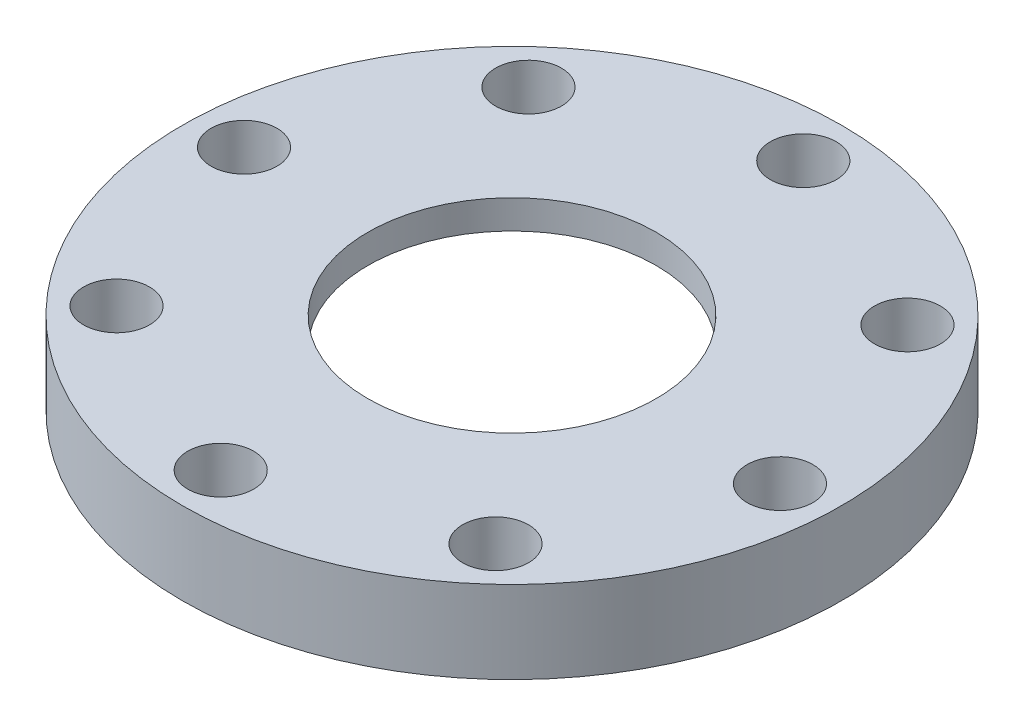
ISO-10303-21;
HEADER;
FILE_DESCRIPTION(('STEP AP214'),'2;1');
FILE_NAME('part.step','',(''),(''),'','','');
FILE_SCHEMA(('AUTOMOTIVE_DESIGN { 1 0 10303 214 1 1 1 1 }'));
ENDSEC;
DATA;
#1=APPLICATION_CONTEXT('core data for automotive mechanical design processes');
#2=APPLICATION_PROTOCOL_DEFINITION('international standard','automotive_design',2000,#1);
#3=PRODUCT_CONTEXT('',#1,'mechanical');
#4=PRODUCT('Part','Part','',(#3));
#5=PRODUCT_RELATED_PRODUCT_CATEGORY('part','',(#4));
#6=PRODUCT_DEFINITION_FORMATION('','',#4);
#7=PRODUCT_DEFINITION_CONTEXT('part definition',#1,'design');
#8=PRODUCT_DEFINITION('design','',#6,#7);
#9=PRODUCT_DEFINITION_SHAPE('','',#8);
#10=(LENGTH_UNIT() NAMED_UNIT(*) SI_UNIT(.MILLI.,.METRE.));
#11=(NAMED_UNIT(*) PLANE_ANGLE_UNIT() SI_UNIT($,.RADIAN.));
#12=(NAMED_UNIT(*) SI_UNIT($,.STERADIAN.) SOLID_ANGLE_UNIT());
#13=UNCERTAINTY_MEASURE_WITH_UNIT(LENGTH_MEASURE(1.E-05),#10,'distance_accuracy_value','');
#14=(GEOMETRIC_REPRESENTATION_CONTEXT(3) GLOBAL_UNCERTAINTY_ASSIGNED_CONTEXT((#13)) GLOBAL_UNIT_ASSIGNED_CONTEXT((#10,
#11,#12)) REPRESENTATION_CONTEXT('',''));
#15=CARTESIAN_POINT('',(0.,0.,0.));
#16=DIRECTION('',(0.,0.,1.));
#17=DIRECTION('',(1.,0.,0.));
#18=AXIS2_PLACEMENT_3D('',#15,#16,#17);
#19=CARTESIAN_POINT('',(0.,10.,0.));
#20=DIRECTION('',(0.,-1.,0.));
#21=DIRECTION('',(0.,0.,-1.));
#22=AXIS2_PLACEMENT_3D('',#19,#20,#21);
#23=CYLINDRICAL_SURFACE('',#22,40.);
#24=CARTESIAN_POINT('',(0.,10.,0.));
#25=DIRECTION('',(0.,1.,0.));
#26=DIRECTION('',(0.,0.,1.));
#27=AXIS2_PLACEMENT_3D('',#24,#25,#26);
#28=CIRCLE('',#27,40.);
#29=CARTESIAN_POINT('',(0.,10.,40.));
#30=VERTEX_POINT('',#29);
#31=EDGE_CURVE('E10',#30,#30,#28,.T.);
#32=ORIENTED_EDGE('',*,*,#31,.F.);
#33=EDGE_LOOP('',(#32));
#34=FACE_BOUND('',#33,.T.);
#35=CARTESIAN_POINT('',(0.,0.,0.));
#36=DIRECTION('',(0.,1.,0.));
#37=DIRECTION('',(0.,0.,1.));
#38=AXIS2_PLACEMENT_3D('',#35,#36,#37);
#39=CIRCLE('',#38,40.);
#40=CARTESIAN_POINT('',(0.,0.,40.));
#41=VERTEX_POINT('',#40);
#42=EDGE_CURVE('E47',#41,#41,#39,.T.);
#43=ORIENTED_EDGE('',*,*,#42,.T.);
#44=EDGE_LOOP('',(#43));
#45=FACE_BOUND('',#44,.T.);
#46=ADVANCED_FACE('F39',(#34,#45),#23,.T.);
#47=CARTESIAN_POINT('',(0.,10.,0.));
#48=DIRECTION('',(0.,1.,0.));
#49=DIRECTION('',(0.,0.,1.));
#50=AXIS2_PLACEMENT_3D('',#47,#48,#49);
#51=PLANE('',#50);
#52=CARTESIAN_POINT('',(-1.41421356237434,10.,33.941125496957));
#53=DIRECTION('',(0.,-1.,0.));
#54=DIRECTION('',(0.,0.,-1.));
#55=AXIS2_PLACEMENT_3D('',#52,#53,#54);
#56=CIRCLE('',#55,4.00000000000239);
#57=CARTESIAN_POINT('',(-1.41421356237434,10.,29.9411254969546));
#58=VERTEX_POINT('',#57);
#59=EDGE_CURVE('E66',#58,#58,#56,.T.);
#60=ORIENTED_EDGE('',*,*,#59,.T.);
#61=EDGE_LOOP('',(#60));
#62=FACE_BOUND('',#61,.T.);
#63=CARTESIAN_POINT('',(22.9999999999998,10.,25.0000000000054));
#64=DIRECTION('',(0.,-1.,0.));
#65=DIRECTION('',(0.,0.,-1.));
#66=AXIS2_PLACEMENT_3D('',#63,#64,#65);
#67=CIRCLE('',#66,4.00000000000536);
#68=CARTESIAN_POINT('',(22.9999999999998,10.,21.0000000000001));
#69=VERTEX_POINT('',#68);
#70=EDGE_CURVE('E115',#69,#69,#67,.T.);
#71=ORIENTED_EDGE('',*,*,#70,.T.);
#72=EDGE_LOOP('',(#71));
#73=FACE_BOUND('',#72,.T.);
#74=CARTESIAN_POINT('',(33.9411254969567,10.,1.41421356237977));
#75=DIRECTION('',(0.,-1.,0.));
#76=DIRECTION('',(0.,0.,-1.));
#77=AXIS2_PLACEMENT_3D('',#74,#75,#76);
#78=CIRCLE('',#77,4.00000000000719);
#79=CARTESIAN_POINT('',(33.9411254969567,10.,-2.58578643762742));
#80=VERTEX_POINT('',#79);
#81=EDGE_CURVE('E107',#80,#80,#78,.T.);
#82=ORIENTED_EDGE('',*,*,#81,.T.);
#83=EDGE_LOOP('',(#82));
#84=FACE_BOUND('',#83,.T.);
#85=CARTESIAN_POINT('',(25.0000000000052,10.,-22.9999999999943));
#86=DIRECTION('',(0.,-1.,0.));
#87=DIRECTION('',(0.,0.,-1.));
#88=AXIS2_PLACEMENT_3D('',#85,#86,#87);
#89=CIRCLE('',#88,4.00000000000685);
#90=CARTESIAN_POINT('',(25.0000000000052,10.,-27.0000000000012));
#91=VERTEX_POINT('',#90);
#92=EDGE_CURVE('E99',#91,#91,#89,.T.);
#93=ORIENTED_EDGE('',*,*,#92,.T.);
#94=EDGE_LOOP('',(#93));
#95=FACE_BOUND('',#94,.T.);
#96=CARTESIAN_POINT('',(1.41421356237955,10.,-33.9411254969513));
#97=DIRECTION('',(0.,-1.,0.));
#98=DIRECTION('',(0.,0.,-1.));
#99=AXIS2_PLACEMENT_3D('',#96,#97,#98);
#100=CIRCLE('',#99,4.00000000000455);
#101=CARTESIAN_POINT('',(1.41421356237955,10.,-37.9411254969558));
#102=VERTEX_POINT('',#101);
#103=EDGE_CURVE('E91',#102,#102,#100,.T.);
#104=ORIENTED_EDGE('',*,*,#103,.T.);
#105=EDGE_LOOP('',(#104));
#106=FACE_BOUND('',#105,.T.);
#107=CARTESIAN_POINT('',(-22.9999999999946,10.,-24.9999999999998));
#108=DIRECTION('',(0.,-1.,0.));
#109=DIRECTION('',(0.,0.,-1.));
#110=AXIS2_PLACEMENT_3D('',#107,#108,#109);
#111=CIRCLE('',#110,4.00000000000168);
#112=CARTESIAN_POINT('',(-22.9999999999946,10.,-29.0000000000015));
#113=VERTEX_POINT('',#112);
#114=EDGE_CURVE('E83',#113,#113,#111,.T.);
#115=ORIENTED_EDGE('',*,*,#114,.T.);
#116=EDGE_LOOP('',(#115));
#117=FACE_BOUND('',#116,.T.);
#118=CARTESIAN_POINT('',(-33.9411254969515,10.,-1.41421356237412));
#119=DIRECTION('',(0.,-1.,0.));
#120=DIRECTION('',(0.,0.,-1.));
#121=AXIS2_PLACEMENT_3D('',#118,#119,#120);
#122=CIRCLE('',#121,3.99999999999996);
#123=CARTESIAN_POINT('',(-33.9411254969515,10.,-5.41421356237408));
#124=VERTEX_POINT('',#123);
#125=EDGE_CURVE('E75',#124,#124,#122,.T.);
#126=ORIENTED_EDGE('',*,*,#125,.T.);
#127=EDGE_LOOP('',(#126));
#128=FACE_BOUND('',#127,.T.);
#129=CARTESIAN_POINT('',(-25.,10.,23.));
#130=DIRECTION('',(0.,-1.,0.));
#131=DIRECTION('',(0.,0.,-1.));
#132=AXIS2_PLACEMENT_3D('',#129,#130,#131);
#133=CIRCLE('',#132,4.);
#134=CARTESIAN_POINT('',(-25.,10.,19.));
#135=VERTEX_POINT('',#134);
#136=EDGE_CURVE('E67',#135,#135,#133,.T.);
#137=ORIENTED_EDGE('',*,*,#136,.T.);
#138=EDGE_LOOP('',(#137));
#139=FACE_BOUND('',#138,.T.);
#140=CARTESIAN_POINT('',(0.,10.,0.));
#141=DIRECTION('',(0.,1.,0.));
#142=DIRECTION('',(0.,0.,1.));
#143=AXIS2_PLACEMENT_3D('',#140,#141,#142);
#144=CIRCLE('',#143,17.5);
#145=CARTESIAN_POINT('',(0.,10.,17.5));
#146=VERTEX_POINT('',#145);
#147=EDGE_CURVE('E62',#146,#146,#144,.T.);
#148=ORIENTED_EDGE('',*,*,#147,.F.);
#149=EDGE_LOOP('',(#148));
#150=FACE_BOUND('',#149,.T.);
#151=ORIENTED_EDGE('',*,*,#31,.T.);
#152=EDGE_LOOP('',(#151));
#153=FACE_BOUND('',#152,.T.);
#154=ADVANCED_FACE('F131',(#62,#73,#84,#95,#106,#117,#128,#139,#150,#153),#51,.T.);
#155=CARTESIAN_POINT('',(0.,0.,0.));
#156=DIRECTION('',(0.,1.,0.));
#157=DIRECTION('',(0.,0.,1.));
#158=AXIS2_PLACEMENT_3D('',#155,#156,#157);
#159=PLANE('',#158);
#160=CARTESIAN_POINT('',(-1.41421356237434,0.,33.941125496957));
#161=DIRECTION('',(0.,-1.,0.));
#162=DIRECTION('',(0.,0.,-1.));
#163=AXIS2_PLACEMENT_3D('',#160,#161,#162);
#164=CIRCLE('',#163,4.00000000000239);
#165=CARTESIAN_POINT('',(-1.41421356237434,0.,29.9411254969546));
#166=VERTEX_POINT('',#165);
#167=EDGE_CURVE('E123',#166,#166,#164,.T.);
#168=ORIENTED_EDGE('',*,*,#167,.F.);
#169=EDGE_LOOP('',(#168));
#170=FACE_BOUND('',#169,.T.);
#171=CARTESIAN_POINT('',(22.9999999999998,0.,25.0000000000054));
#172=DIRECTION('',(0.,-1.,0.));
#173=DIRECTION('',(0.,0.,-1.));
#174=AXIS2_PLACEMENT_3D('',#171,#172,#173);
#175=CIRCLE('',#174,4.00000000000536);
#176=CARTESIAN_POINT('',(22.9999999999998,0.,21.0000000000001));
#177=VERTEX_POINT('',#176);
#178=EDGE_CURVE('E119',#177,#177,#175,.T.);
#179=ORIENTED_EDGE('',*,*,#178,.F.);
#180=EDGE_LOOP('',(#179));
#181=FACE_BOUND('',#180,.T.);
#182=CARTESIAN_POINT('',(33.9411254969567,0.,1.41421356237977));
#183=DIRECTION('',(0.,-1.,0.));
#184=DIRECTION('',(0.,0.,-1.));
#185=AXIS2_PLACEMENT_3D('',#182,#183,#184);
#186=CIRCLE('',#185,4.00000000000719);
#187=CARTESIAN_POINT('',(33.9411254969567,0.,-2.58578643762742));
#188=VERTEX_POINT('',#187);
#189=EDGE_CURVE('E111',#188,#188,#186,.T.);
#190=ORIENTED_EDGE('',*,*,#189,.F.);
#191=EDGE_LOOP('',(#190));
#192=FACE_BOUND('',#191,.T.);
#193=CARTESIAN_POINT('',(25.0000000000052,0.,-22.9999999999943));
#194=DIRECTION('',(0.,-1.,0.));
#195=DIRECTION('',(0.,0.,-1.));
#196=AXIS2_PLACEMENT_3D('',#193,#194,#195);
#197=CIRCLE('',#196,4.00000000000685);
#198=CARTESIAN_POINT('',(25.0000000000052,0.,-27.0000000000012));
#199=VERTEX_POINT('',#198);
#200=EDGE_CURVE('E103',#199,#199,#197,.T.);
#201=ORIENTED_EDGE('',*,*,#200,.F.);
#202=EDGE_LOOP('',(#201));
#203=FACE_BOUND('',#202,.T.);
#204=CARTESIAN_POINT('',(1.41421356237955,0.,-33.9411254969513));
#205=DIRECTION('',(0.,-1.,0.));
#206=DIRECTION('',(0.,0.,-1.));
#207=AXIS2_PLACEMENT_3D('',#204,#205,#206);
#208=CIRCLE('',#207,4.00000000000455);
#209=CARTESIAN_POINT('',(1.41421356237955,0.,-37.9411254969558));
#210=VERTEX_POINT('',#209);
#211=EDGE_CURVE('E95',#210,#210,#208,.T.);
#212=ORIENTED_EDGE('',*,*,#211,.F.);
#213=EDGE_LOOP('',(#212));
#214=FACE_BOUND('',#213,.T.);
#215=CARTESIAN_POINT('',(-22.9999999999946,0.,-24.9999999999998));
#216=DIRECTION('',(0.,-1.,0.));
#217=DIRECTION('',(0.,0.,-1.));
#218=AXIS2_PLACEMENT_3D('',#215,#216,#217);
#219=CIRCLE('',#218,4.00000000000168);
#220=CARTESIAN_POINT('',(-22.9999999999946,0.,-29.0000000000015));
#221=VERTEX_POINT('',#220);
#222=EDGE_CURVE('E87',#221,#221,#219,.T.);
#223=ORIENTED_EDGE('',*,*,#222,.F.);
#224=EDGE_LOOP('',(#223));
#225=FACE_BOUND('',#224,.T.);
#226=CARTESIAN_POINT('',(-33.9411254969515,0.,-1.41421356237412));
#227=DIRECTION('',(0.,-1.,0.));
#228=DIRECTION('',(0.,0.,-1.));
#229=AXIS2_PLACEMENT_3D('',#226,#227,#228);
#230=CIRCLE('',#229,3.99999999999996);
#231=CARTESIAN_POINT('',(-33.9411254969515,0.,-5.41421356237408));
#232=VERTEX_POINT('',#231);
#233=EDGE_CURVE('E79',#232,#232,#230,.T.);
#234=ORIENTED_EDGE('',*,*,#233,.F.);
#235=EDGE_LOOP('',(#234));
#236=FACE_BOUND('',#235,.T.);
#237=CARTESIAN_POINT('',(-25.,0.,23.));
#238=DIRECTION('',(0.,-1.,0.));
#239=DIRECTION('',(0.,0.,-1.));
#240=AXIS2_PLACEMENT_3D('',#237,#238,#239);
#241=CIRCLE('',#240,4.);
#242=CARTESIAN_POINT('',(-25.,0.,19.));
#243=VERTEX_POINT('',#242);
#244=EDGE_CURVE('E71',#243,#243,#241,.T.);
#245=ORIENTED_EDGE('',*,*,#244,.F.);
#246=EDGE_LOOP('',(#245));
#247=FACE_BOUND('',#246,.T.);
#248=CARTESIAN_POINT('',(0.,0.,0.));
#249=DIRECTION('',(0.,-1.,0.));
#250=DIRECTION('',(0.,0.,-1.));
#251=AXIS2_PLACEMENT_3D('',#248,#249,#250);
#252=CIRCLE('',#251,27.5);
#253=CARTESIAN_POINT('',(0.,0.,-27.5));
#254=VERTEX_POINT('',#253);
#255=EDGE_CURVE('E55',#254,#254,#252,.T.);
#256=ORIENTED_EDGE('',*,*,#255,.F.);
#257=EDGE_LOOP('',(#256));
#258=FACE_BOUND('',#257,.T.);
#259=ORIENTED_EDGE('',*,*,#42,.F.);
#260=EDGE_LOOP('',(#259));
#261=FACE_BOUND('',#260,.T.);
#262=ADVANCED_FACE('F141',(#170,#181,#192,#203,#214,#225,#236,#247,#258,#261),#159,.F.);
#263=CARTESIAN_POINT('',(0.,6.5,0.));
#264=DIRECTION('',(0.,-1.,0.));
#265=DIRECTION('',(0.,0.,-1.));
#266=AXIS2_PLACEMENT_3D('',#263,#264,#265);
#267=CYLINDRICAL_SURFACE('',#266,27.5);
#268=CARTESIAN_POINT('',(0.,6.5,0.));
#269=DIRECTION('',(0.,-1.,0.));
#270=DIRECTION('',(0.,0.,-1.));
#271=AXIS2_PLACEMENT_3D('',#268,#269,#270);
#272=CIRCLE('',#271,27.5);
#273=CARTESIAN_POINT('',(0.,6.5,-27.5));
#274=VERTEX_POINT('',#273);
#275=EDGE_CURVE('E53',#274,#274,#272,.T.);
#276=CARTESIAN_POINT('',(0.,6.5,-27.5));
#277=CARTESIAN_POINT('',(0.,6.43229166666667,-27.5));
#278=CARTESIAN_POINT('',(0.,6.36458333333333,-27.5));
#279=CARTESIAN_POINT('',(0.,6.22916666666667,-27.5));
#280=CARTESIAN_POINT('',(0.,6.16145833333333,-27.5));
#281=CARTESIAN_POINT('',(0.,6.02604166666667,-27.5));
#282=CARTESIAN_POINT('',(0.,5.95833333333333,-27.5));
#283=CARTESIAN_POINT('',(0.,5.82291666666667,-27.5));
#284=CARTESIAN_POINT('',(0.,5.75520833333333,-27.5));
#285=CARTESIAN_POINT('',(0.,5.61979166666667,-27.5));
#286=CARTESIAN_POINT('',(0.,5.55208333333333,-27.5));
#287=CARTESIAN_POINT('',(0.,5.41666666666667,-27.5));
#288=CARTESIAN_POINT('',(0.,5.34895833333333,-27.5));
#289=CARTESIAN_POINT('',(0.,5.21354166666667,-27.5));
#290=CARTESIAN_POINT('',(0.,5.14583333333333,-27.5));
#291=CARTESIAN_POINT('',(0.,5.01041666666667,-27.5));
#292=CARTESIAN_POINT('',(0.,4.94270833333333,-27.5));
#293=CARTESIAN_POINT('',(0.,4.80729166666667,-27.5));
#294=CARTESIAN_POINT('',(0.,4.73958333333333,-27.5));
#295=CARTESIAN_POINT('',(0.,4.60416666666667,-27.5));
#296=CARTESIAN_POINT('',(0.,4.53645833333333,-27.5));
#297=CARTESIAN_POINT('',(0.,4.40104166666667,-27.5));
#298=CARTESIAN_POINT('',(0.,4.33333333333333,-27.5));
#299=CARTESIAN_POINT('',(0.,4.19791666666667,-27.5));
#300=CARTESIAN_POINT('',(0.,4.13020833333333,-27.5));
#301=CARTESIAN_POINT('',(0.,3.99479166666667,-27.5));
#302=CARTESIAN_POINT('',(0.,3.92708333333333,-27.5));
#303=CARTESIAN_POINT('',(0.,3.79166666666667,-27.5));
#304=CARTESIAN_POINT('',(0.,3.72395833333333,-27.5));
#305=CARTESIAN_POINT('',(0.,3.58854166666667,-27.5));
#306=CARTESIAN_POINT('',(0.,3.52083333333333,-27.5));
#307=CARTESIAN_POINT('',(0.,3.38541666666667,-27.5));
#308=CARTESIAN_POINT('',(0.,3.31770833333333,-27.5));
#309=CARTESIAN_POINT('',(0.,3.18229166666667,-27.5));
#310=CARTESIAN_POINT('',(0.,3.11458333333333,-27.5));
#311=CARTESIAN_POINT('',(0.,2.97916666666667,-27.5));
#312=CARTESIAN_POINT('',(0.,2.91145833333333,-27.5));
#313=CARTESIAN_POINT('',(0.,2.77604166666667,-27.5));
#314=CARTESIAN_POINT('',(0.,2.70833333333333,-27.5));
#315=CARTESIAN_POINT('',(0.,2.57291666666667,-27.5));
#316=CARTESIAN_POINT('',(0.,2.50520833333333,-27.5));
#317=CARTESIAN_POINT('',(0.,2.36979166666667,-27.5));
#318=CARTESIAN_POINT('',(0.,2.30208333333333,-27.5));
#319=CARTESIAN_POINT('',(0.,2.16666666666667,-27.5));
#320=CARTESIAN_POINT('',(0.,2.09895833333333,-27.5));
#321=CARTESIAN_POINT('',(0.,1.96354166666667,-27.5));
#322=CARTESIAN_POINT('',(0.,1.89583333333333,-27.5));
#323=CARTESIAN_POINT('',(0.,1.76041666666667,-27.5));
#324=CARTESIAN_POINT('',(0.,1.69270833333333,-27.5));
#325=CARTESIAN_POINT('',(0.,1.55729166666667,-27.5));
#326=CARTESIAN_POINT('',(0.,1.48958333333333,-27.5));
#327=CARTESIAN_POINT('',(0.,1.35416666666667,-27.5));
#328=CARTESIAN_POINT('',(0.,1.28645833333333,-27.5));
#329=CARTESIAN_POINT('',(0.,1.15104166666667,-27.5));
#330=CARTESIAN_POINT('',(0.,1.08333333333333,-27.5));
#331=CARTESIAN_POINT('',(0.,0.947916666666667,-27.5));
#332=CARTESIAN_POINT('',(0.,0.880208333333333,-27.5));
#333=CARTESIAN_POINT('',(0.,0.744791666666667,-27.5));
#334=CARTESIAN_POINT('',(0.,0.677083333333334,-27.5));
#335=CARTESIAN_POINT('',(0.,0.541666666666667,-27.5));
#336=CARTESIAN_POINT('',(0.,0.473958333333334,-27.5));
#337=CARTESIAN_POINT('',(0.,0.338541666666667,-27.5));
#338=CARTESIAN_POINT('',(0.,0.270833333333334,-27.5));
#339=CARTESIAN_POINT('',(0.,0.135416666666667,-27.5));
#340=CARTESIAN_POINT('',(0.,0.0677083333333333,-27.5));
#341=CARTESIAN_POINT('',(0.,0.,-27.5));
#342=B_SPLINE_CURVE_WITH_KNOTS('',3,(#276,#277,#278,#279,#280,#281,#282,#283,#284,#285,#286,
#287,#288,#289,#290,#291,#292,#293,#294,#295,#296,#297,#298,#299,#300,#301,#302,#303,#304,#305,
#306,#307,#308,#309,#310,#311,#312,#313,#314,#315,#316,#317,#318,#319,#320,#321,#322,#323,#324,
#325,#326,#327,#328,#329,#330,#331,#332,#333,#334,#335,#336,#337,#338,#339,#340,#341),
.UNSPECIFIED.,.F.,.F.,(4,2,2,2,2,2,2,2,2,2,2,2,2,2,2,2,2,2,2,2,2,2,2,2,2,2,2,2,2,2,2,2,4),(0.,
0.203125,0.40625,0.609375000000001,0.812500000000001,1.015625,1.21875,1.421875,1.625,1.828125,
2.03125,2.234375,2.4375,2.640625,2.84375,3.046875,3.25,3.453125,3.65625,3.859375,4.0625,
4.265625,4.46875,4.671875,4.875,5.078125,5.28125,5.484375,5.6875,5.890625,6.09375,6.296875,6.5),.UNSPECIFIED.);
#343=EDGE_CURVE('BSEAM144',#274,#254,#342,.T.);
#344=ORIENTED_EDGE('',*,*,#275,.F.);
#345=ORIENTED_EDGE('',*,*,#255,.T.);
#346=ORIENTED_EDGE('',*,*,#343,.T.);
#347=ORIENTED_EDGE('',*,*,#343,.F.);
#348=EDGE_LOOP('',(#344,#346,#345,#347));
#349=FACE_BOUND('',#348,.T.);
#350=ADVANCED_FACE('F144',(#349),#267,.F.);
#351=CARTESIAN_POINT('',(0.,6.5,0.));
#352=DIRECTION('',(0.,-1.,0.));
#353=DIRECTION('',(0.,0.,-1.));
#354=AXIS2_PLACEMENT_3D('',#351,#352,#353);
#355=PLANE('',#354);
#356=CARTESIAN_POINT('',(0.,6.5,0.));
#357=DIRECTION('',(0.,-1.,0.));
#358=DIRECTION('',(0.,0.,-1.));
#359=AXIS2_PLACEMENT_3D('',#356,#357,#358);
#360=CIRCLE('',#359,17.5);
#361=CARTESIAN_POINT('',(0.,6.5,-17.5));
#362=VERTEX_POINT('',#361);
#363=EDGE_CURVE('E42',#362,#362,#360,.T.);
#364=ORIENTED_EDGE('',*,*,#363,.F.);
#365=EDGE_LOOP('',(#364));
#366=FACE_BOUND('',#365,.T.);
#367=ORIENTED_EDGE('',*,*,#275,.T.);
#368=EDGE_LOOP('',(#367));
#369=FACE_BOUND('',#368,.T.);
#370=ADVANCED_FACE('F174',(#366,#369),#355,.T.);
#371=CARTESIAN_POINT('',(0.,0.,0.));
#372=DIRECTION('',(0.,1.,0.));
#373=DIRECTION('',(0.,0.,1.));
#374=AXIS2_PLACEMENT_3D('',#371,#372,#373);
#375=CYLINDRICAL_SURFACE('',#374,17.5);
#376=ORIENTED_EDGE('',*,*,#363,.T.);
#377=EDGE_LOOP('',(#376));
#378=FACE_BOUND('',#377,.T.);
#379=ORIENTED_EDGE('',*,*,#147,.T.);
#380=EDGE_LOOP('',(#379));
#381=FACE_BOUND('',#380,.T.);
#382=ADVANCED_FACE('F178',(#378,#381),#375,.F.);
#383=CARTESIAN_POINT('',(-25.,10.,23.));
#384=DIRECTION('',(0.,-1.,0.));
#385=DIRECTION('',(0.,0.,-1.));
#386=AXIS2_PLACEMENT_3D('',#383,#384,#385);
#387=CYLINDRICAL_SURFACE('',#386,4.);
#388=ORIENTED_EDGE('',*,*,#136,.F.);
#389=EDGE_LOOP('',(#388));
#390=FACE_BOUND('',#389,.T.);
#391=ORIENTED_EDGE('',*,*,#244,.T.);
#392=EDGE_LOOP('',(#391));
#393=FACE_BOUND('',#392,.T.);
#394=ADVANCED_FACE('F182',(#390,#393),#387,.F.);
#395=CARTESIAN_POINT('',(-33.9411254969515,10.,-1.41421356237412));
#396=DIRECTION('',(0.,-1.,0.));
#397=DIRECTION('',(0.,0.,-1.));
#398=AXIS2_PLACEMENT_3D('',#395,#396,#397);
#399=CYLINDRICAL_SURFACE('',#398,3.99999999999996);
#400=ORIENTED_EDGE('',*,*,#125,.F.);
#401=EDGE_LOOP('',(#400));
#402=FACE_BOUND('',#401,.T.);
#403=ORIENTED_EDGE('',*,*,#233,.T.);
#404=EDGE_LOOP('',(#403));
#405=FACE_BOUND('',#404,.T.);
#406=ADVANCED_FACE('F186',(#402,#405),#399,.F.);
#407=CARTESIAN_POINT('',(-22.9999999999946,10.,-24.9999999999998));
#408=DIRECTION('',(0.,-1.,0.));
#409=DIRECTION('',(0.,0.,-1.));
#410=AXIS2_PLACEMENT_3D('',#407,#408,#409);
#411=CYLINDRICAL_SURFACE('',#410,4.00000000000168);
#412=ORIENTED_EDGE('',*,*,#114,.F.);
#413=EDGE_LOOP('',(#412));
#414=FACE_BOUND('',#413,.T.);
#415=ORIENTED_EDGE('',*,*,#222,.T.);
#416=EDGE_LOOP('',(#415));
#417=FACE_BOUND('',#416,.T.);
#418=ADVANCED_FACE('F190',(#414,#417),#411,.F.);
#419=CARTESIAN_POINT('',(1.41421356237955,10.,-33.9411254969513));
#420=DIRECTION('',(0.,-1.,0.));
#421=DIRECTION('',(0.,0.,-1.));
#422=AXIS2_PLACEMENT_3D('',#419,#420,#421);
#423=CYLINDRICAL_SURFACE('',#422,4.00000000000455);
#424=ORIENTED_EDGE('',*,*,#103,.F.);
#425=EDGE_LOOP('',(#424));
#426=FACE_BOUND('',#425,.T.);
#427=ORIENTED_EDGE('',*,*,#211,.T.);
#428=EDGE_LOOP('',(#427));
#429=FACE_BOUND('',#428,.T.);
#430=ADVANCED_FACE('F194',(#426,#429),#423,.F.);
#431=CARTESIAN_POINT('',(25.0000000000052,10.,-22.9999999999943));
#432=DIRECTION('',(0.,-1.,0.));
#433=DIRECTION('',(0.,0.,-1.));
#434=AXIS2_PLACEMENT_3D('',#431,#432,#433);
#435=CYLINDRICAL_SURFACE('',#434,4.00000000000685);
#436=ORIENTED_EDGE('',*,*,#92,.F.);
#437=EDGE_LOOP('',(#436));
#438=FACE_BOUND('',#437,.T.);
#439=ORIENTED_EDGE('',*,*,#200,.T.);
#440=EDGE_LOOP('',(#439));
#441=FACE_BOUND('',#440,.T.);
#442=ADVANCED_FACE('F198',(#438,#441),#435,.F.);
#443=CARTESIAN_POINT('',(33.9411254969567,10.,1.41421356237977));
#444=DIRECTION('',(0.,-1.,0.));
#445=DIRECTION('',(0.,0.,-1.));
#446=AXIS2_PLACEMENT_3D('',#443,#444,#445);
#447=CYLINDRICAL_SURFACE('',#446,4.00000000000719);
#448=ORIENTED_EDGE('',*,*,#81,.F.);
#449=EDGE_LOOP('',(#448));
#450=FACE_BOUND('',#449,.T.);
#451=ORIENTED_EDGE('',*,*,#189,.T.);
#452=EDGE_LOOP('',(#451));
#453=FACE_BOUND('',#452,.T.);
#454=ADVANCED_FACE('F202',(#450,#453),#447,.F.);
#455=CARTESIAN_POINT('',(22.9999999999998,10.,25.0000000000054));
#456=DIRECTION('',(0.,-1.,0.));
#457=DIRECTION('',(0.,0.,-1.));
#458=AXIS2_PLACEMENT_3D('',#455,#456,#457);
#459=CYLINDRICAL_SURFACE('',#458,4.00000000000536);
#460=ORIENTED_EDGE('',*,*,#70,.F.);
#461=EDGE_LOOP('',(#460));
#462=FACE_BOUND('',#461,.T.);
#463=ORIENTED_EDGE('',*,*,#178,.T.);
#464=EDGE_LOOP('',(#463));
#465=FACE_BOUND('',#464,.T.);
#466=ADVANCED_FACE('F137',(#462,#465),#459,.F.);
#467=CARTESIAN_POINT('',(-1.41421356237434,10.,33.941125496957));
#468=DIRECTION('',(0.,-1.,0.));
#469=DIRECTION('',(0.,0.,-1.));
#470=AXIS2_PLACEMENT_3D('',#467,#468,#469);
#471=CYLINDRICAL_SURFACE('',#470,4.00000000000239);
#472=ORIENTED_EDGE('',*,*,#59,.F.);
#473=EDGE_LOOP('',(#472));
#474=FACE_BOUND('',#473,.T.);
#475=ORIENTED_EDGE('',*,*,#167,.T.);
#476=EDGE_LOOP('',(#475));
#477=FACE_BOUND('',#476,.T.);
#478=ADVANCED_FACE('F134',(#474,#477),#471,.F.);
#479=CLOSED_SHELL('',(#46,#154,#262,#350,#370,#382,#394,#406,#418,#430,#442,#454,#466,#478));
#480=MANIFOLD_SOLID_BREP('B2',#479);
#481=ADVANCED_BREP_SHAPE_REPRESENTATION('',(#18,#480),#14);
#482=SHAPE_DEFINITION_REPRESENTATION(#9,#481);
ENDSEC;
END-ISO-10303-21;
